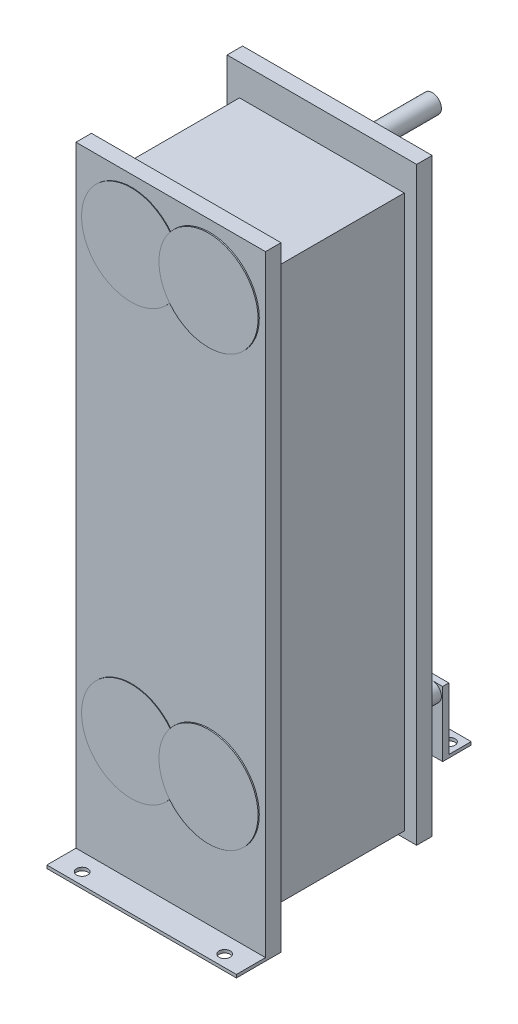
ISO-10303-21;
HEADER;
FILE_DESCRIPTION(('STEP AP214'),'2;1');
FILE_NAME('part.step','',(''),(''),'','','');
FILE_SCHEMA(('AUTOMOTIVE_DESIGN { 1 0 10303 214 1 1 1 1 }'));
ENDSEC;
DATA;
#1=APPLICATION_CONTEXT('core data for automotive mechanical design processes');
#2=APPLICATION_PROTOCOL_DEFINITION('international standard','automotive_design',2000,#1);
#3=PRODUCT_CONTEXT('',#1,'mechanical');
#4=PRODUCT('Part','Part','',(#3));
#5=PRODUCT_RELATED_PRODUCT_CATEGORY('part','',(#4));
#6=PRODUCT_DEFINITION_FORMATION('','',#4);
#7=PRODUCT_DEFINITION_CONTEXT('part definition',#1,'design');
#8=PRODUCT_DEFINITION('design','',#6,#7);
#9=PRODUCT_DEFINITION_SHAPE('','',#8);
#10=(LENGTH_UNIT() NAMED_UNIT(*) SI_UNIT(.MILLI.,.METRE.));
#11=(NAMED_UNIT(*) PLANE_ANGLE_UNIT() SI_UNIT($,.RADIAN.));
#12=(NAMED_UNIT(*) SI_UNIT($,.STERADIAN.) SOLID_ANGLE_UNIT());
#13=UNCERTAINTY_MEASURE_WITH_UNIT(LENGTH_MEASURE(1.E-05),#10,'distance_accuracy_value','');
#14=(GEOMETRIC_REPRESENTATION_CONTEXT(3) GLOBAL_UNCERTAINTY_ASSIGNED_CONTEXT((#13)) GLOBAL_UNIT_ASSIGNED_CONTEXT((#10,
#11,#12)) REPRESENTATION_CONTEXT('',''));
#15=CARTESIAN_POINT('',(0.,0.,0.));
#16=DIRECTION('',(0.,0.,1.));
#17=DIRECTION('',(1.,0.,0.));
#18=AXIS2_PLACEMENT_3D('',#15,#16,#17);
#19=CARTESIAN_POINT('',(153.,-496.,25.));
#20=DIRECTION('',(0.,0.,1.));
#21=DIRECTION('',(1.,0.,0.));
#22=AXIS2_PLACEMENT_3D('',#19,#20,#21);
#23=PLANE('',#22);
#24=CARTESIAN_POINT('',(63.0000000000001,-296.,25.));
#25=DIRECTION('',(0.,0.,1.));
#26=DIRECTION('',(1.,0.,0.));
#27=AXIS2_PLACEMENT_3D('',#24,#25,#26);
#28=CIRCLE('',#27,80.);
#29=CARTESIAN_POINT('',(0.,-345.305172142484,25.));
#30=VERTEX_POINT('',#29);
#31=CARTESIAN_POINT('',(0.,-246.694827857516,25.));
#32=VERTEX_POINT('',#31);
#33=EDGE_CURVE('E48',#30,#32,#28,.T.);
#34=ORIENTED_EDGE('',*,*,#33,.F.);
#35=CARTESIAN_POINT('',(-63.0000000000001,-296.,25.));
#36=DIRECTION('',(0.,0.,1.));
#37=DIRECTION('',(1.,0.,0.));
#38=AXIS2_PLACEMENT_3D('',#35,#36,#37);
#39=CIRCLE('',#38,80.);
#40=EDGE_CURVE('E206',#32,#30,#39,.T.);
#41=ORIENTED_EDGE('',*,*,#40,.F.);
#42=EDGE_LOOP('',(#34,#41));
#43=FACE_BOUND('',#42,.T.);
#44=CARTESIAN_POINT('',(63.,398.,25.));
#45=DIRECTION('',(0.,0.,1.));
#46=DIRECTION('',(1.,0.,0.));
#47=AXIS2_PLACEMENT_3D('',#44,#45,#46);
#48=CIRCLE('',#47,80.);
#49=CARTESIAN_POINT('',(0.,348.694827857516,25.));
#50=VERTEX_POINT('',#49);
#51=CARTESIAN_POINT('',(0.,447.305172142484,25.));
#52=VERTEX_POINT('',#51);
#53=EDGE_CURVE('E201',#50,#52,#48,.T.);
#54=ORIENTED_EDGE('',*,*,#53,.F.);
#55=CARTESIAN_POINT('',(-63.,398.,25.));
#56=DIRECTION('',(0.,0.,1.));
#57=DIRECTION('',(1.,0.,0.));
#58=AXIS2_PLACEMENT_3D('',#55,#56,#57);
#59=CIRCLE('',#58,80.);
#60=EDGE_CURVE('E333',#52,#50,#59,.T.);
#61=ORIENTED_EDGE('',*,*,#60,.F.);
#62=EDGE_LOOP('',(#54,#61));
#63=FACE_BOUND('',#62,.T.);
#64=DIRECTION('',(0.,-1.,0.));
#65=VECTOR('',#64,1.);
#66=CARTESIAN_POINT('',(-153.,496.,25.));
#67=LINE('',#66,#65);
#68=CARTESIAN_POINT('',(-153.,496.,25.));
#69=VERTEX_POINT('',#68);
#70=CARTESIAN_POINT('',(-153.,-491.,25.));
#71=VERTEX_POINT('',#70);
#72=EDGE_CURVE('E322',#69,#71,#67,.T.);
#73=ORIENTED_EDGE('',*,*,#72,.T.);
#74=DIRECTION('',(1.,0.,0.));
#75=VECTOR('',#74,1.);
#76=CARTESIAN_POINT('',(-153.,-491.,25.));
#77=LINE('',#76,#75);
#78=CARTESIAN_POINT('',(153.,-491.,25.));
#79=VERTEX_POINT('',#78);
#80=EDGE_CURVE('E316',#71,#79,#77,.T.);
#81=ORIENTED_EDGE('',*,*,#80,.T.);
#82=DIRECTION('',(0.,1.,0.));
#83=VECTOR('',#82,1.);
#84=CARTESIAN_POINT('',(153.,496.,25.));
#85=LINE('',#84,#83);
#86=CARTESIAN_POINT('',(153.,496.,25.));
#87=VERTEX_POINT('',#86);
#88=EDGE_CURVE('E365',#79,#87,#85,.T.);
#89=ORIENTED_EDGE('',*,*,#88,.T.);
#90=DIRECTION('',(-1.,0.,0.));
#91=VECTOR('',#90,1.);
#92=CARTESIAN_POINT('',(-153.,496.,25.));
#93=LINE('',#92,#91);
#94=EDGE_CURVE('E357',#87,#69,#93,.T.);
#95=ORIENTED_EDGE('',*,*,#94,.T.);
#96=EDGE_LOOP('',(#73,#81,#89,#95));
#97=FACE_BOUND('',#96,.T.);
#98=ADVANCED_FACE('F34',(#43,#63,#97),#23,.T.);
#99=CARTESIAN_POINT('',(153.,-456.,-244.));
#100=DIRECTION('',(0.,0.,-1.));
#101=DIRECTION('',(-1.,0.,0.));
#102=AXIS2_PLACEMENT_3D('',#99,#100,#101);
#103=PLANE('',#102);
#104=CARTESIAN_POINT('',(-1.11150550783782E-13,-406.,-244.));
#105=DIRECTION('',(0.,0.,-1.));
#106=DIRECTION('',(-1.,0.,0.));
#107=AXIS2_PLACEMENT_3D('',#104,#105,#106);
#108=CIRCLE('',#107,15.);
#109=CARTESIAN_POINT('',(-15.0000000000001,-406.,-244.));
#110=VERTEX_POINT('',#109);
#111=EDGE_CURVE('E291',#110,#110,#108,.T.);
#112=ORIENTED_EDGE('',*,*,#111,.F.);
#113=EDGE_LOOP('',(#112));
#114=FACE_BOUND('',#113,.T.);
#115=DIRECTION('',(0.,-1.,0.));
#116=VECTOR('',#115,1.);
#117=CARTESIAN_POINT('',(153.,496.,-244.));
#118=LINE('',#117,#116);
#119=CARTESIAN_POINT('',(153.,496.,-244.));
#120=VERTEX_POINT('',#119);
#121=CARTESIAN_POINT('',(153.,-456.,-244.));
#122=VERTEX_POINT('',#121);
#123=EDGE_CURVE('E412',#120,#122,#118,.T.);
#124=ORIENTED_EDGE('',*,*,#123,.T.);
#125=DIRECTION('',(-1.,0.,0.));
#126=VECTOR('',#125,1.);
#127=CARTESIAN_POINT('',(153.,-456.,-244.));
#128=LINE('',#127,#126);
#129=CARTESIAN_POINT('',(-153.,-456.,-244.));
#130=VERTEX_POINT('',#129);
#131=EDGE_CURVE('E415',#122,#130,#128,.T.);
#132=ORIENTED_EDGE('',*,*,#131,.T.);
#133=DIRECTION('',(0.,1.,0.));
#134=VECTOR('',#133,1.);
#135=CARTESIAN_POINT('',(-153.,496.,-244.));
#136=LINE('',#135,#134);
#137=CARTESIAN_POINT('',(-153.,496.,-244.));
#138=VERTEX_POINT('',#137);
#139=EDGE_CURVE('E418',#130,#138,#136,.T.);
#140=ORIENTED_EDGE('',*,*,#139,.T.);
#141=DIRECTION('',(1.,0.,0.));
#142=VECTOR('',#141,1.);
#143=CARTESIAN_POINT('',(153.,496.,-244.));
#144=LINE('',#143,#142);
#145=EDGE_CURVE('E420',#138,#120,#144,.T.);
#146=ORIENTED_EDGE('',*,*,#145,.T.);
#147=EDGE_LOOP('',(#124,#132,#140,#146));
#148=FACE_BOUND('',#147,.T.);
#149=CARTESIAN_POINT('',(0.,416.,-244.));
#150=DIRECTION('',(0.,0.,-1.));
#151=DIRECTION('',(-1.,0.,0.));
#152=AXIS2_PLACEMENT_3D('',#149,#150,#151);
#153=CIRCLE('',#152,15.);
#154=CARTESIAN_POINT('',(-15.,416.,-244.));
#155=VERTEX_POINT('',#154);
#156=EDGE_CURVE('E228',#155,#155,#153,.T.);
#157=ORIENTED_EDGE('',*,*,#156,.F.);
#158=EDGE_LOOP('',(#157));
#159=FACE_BOUND('',#158,.T.);
#160=ADVANCED_FACE('F351',(#114,#148,#159),#103,.T.);
#161=CARTESIAN_POINT('',(153.,-496.,0.));
#162=DIRECTION('',(0.,0.,1.));
#163=DIRECTION('',(1.,0.,0.));
#164=AXIS2_PLACEMENT_3D('',#161,#162,#163);
#165=PLANE('',#164);
#166=DIRECTION('',(0.,1.,0.));
#167=VECTOR('',#166,1.);
#168=CARTESIAN_POINT('',(153.,496.,0.));
#169=LINE('',#168,#167);
#170=CARTESIAN_POINT('',(153.,-496.,0.));
#171=VERTEX_POINT('',#170);
#172=CARTESIAN_POINT('',(153.,496.,0.));
#173=VERTEX_POINT('',#172);
#174=EDGE_CURVE('E373',#171,#173,#169,.T.);
#175=ORIENTED_EDGE('',*,*,#174,.F.);
#176=DIRECTION('',(1.,0.,0.));
#177=VECTOR('',#176,1.);
#178=CARTESIAN_POINT('',(-153.,-496.,0.));
#179=LINE('',#178,#177);
#180=CARTESIAN_POINT('',(-153.,-496.,0.));
#181=VERTEX_POINT('',#180);
#182=EDGE_CURVE('E367',#181,#171,#179,.T.);
#183=ORIENTED_EDGE('',*,*,#182,.F.);
#184=DIRECTION('',(0.,-1.,0.));
#185=VECTOR('',#184,1.);
#186=CARTESIAN_POINT('',(-153.,496.,0.));
#187=LINE('',#186,#185);
#188=CARTESIAN_POINT('',(-153.,496.,0.));
#189=VERTEX_POINT('',#188);
#190=EDGE_CURVE('E379',#189,#181,#187,.T.);
#191=ORIENTED_EDGE('',*,*,#190,.F.);
#192=DIRECTION('',(-1.,0.,0.));
#193=VECTOR('',#192,1.);
#194=CARTESIAN_POINT('',(-153.,496.,0.));
#195=LINE('',#194,#193);
#196=EDGE_CURVE('E376',#173,#189,#195,.T.);
#197=ORIENTED_EDGE('',*,*,#196,.F.);
#198=EDGE_LOOP('',(#175,#183,#191,#197));
#199=FACE_BOUND('',#198,.T.);
#200=DIRECTION('',(0.,-1.,0.));
#201=VECTOR('',#200,1.);
#202=CARTESIAN_POINT('',(133.,446.,0.));
#203=LINE('',#202,#201);
#204=CARTESIAN_POINT('',(133.,446.,0.));
#205=VERTEX_POINT('',#204);
#206=CARTESIAN_POINT('',(133.,-446.,0.));
#207=VERTEX_POINT('',#206);
#208=EDGE_CURVE('E455',#205,#207,#203,.T.);
#209=ORIENTED_EDGE('',*,*,#208,.F.);
#210=DIRECTION('',(1.,0.,0.));
#211=VECTOR('',#210,1.);
#212=CARTESIAN_POINT('',(-133.,446.,0.));
#213=LINE('',#212,#211);
#214=CARTESIAN_POINT('',(-133.,446.,0.));
#215=VERTEX_POINT('',#214);
#216=EDGE_CURVE('E442',#215,#205,#213,.T.);
#217=ORIENTED_EDGE('',*,*,#216,.F.);
#218=DIRECTION('',(0.,1.,0.));
#219=VECTOR('',#218,1.);
#220=CARTESIAN_POINT('',(-133.,446.,0.));
#221=LINE('',#220,#219);
#222=CARTESIAN_POINT('',(-133.,-446.,0.));
#223=VERTEX_POINT('',#222);
#224=EDGE_CURVE('E447',#223,#215,#221,.T.);
#225=ORIENTED_EDGE('',*,*,#224,.F.);
#226=DIRECTION('',(-1.,0.,0.));
#227=VECTOR('',#226,1.);
#228=CARTESIAN_POINT('',(-133.,-446.,0.));
#229=LINE('',#228,#227);
#230=EDGE_CURVE('E451',#207,#223,#229,.T.);
#231=ORIENTED_EDGE('',*,*,#230,.F.);
#232=EDGE_LOOP('',(#209,#217,#225,#231));
#233=FACE_BOUND('',#232,.T.);
#234=ADVANCED_FACE('F395',(#199,#233),#165,.F.);
#235=CARTESIAN_POINT('',(153.,496.,25.));
#236=DIRECTION('',(-1.,0.,0.));
#237=DIRECTION('',(0.,-1.,0.));
#238=AXIS2_PLACEMENT_3D('',#235,#236,#237);
#239=PLANE('',#238);
#240=ORIENTED_EDGE('',*,*,#174,.T.);
#241=DIRECTION('',(0.,0.,-1.));
#242=VECTOR('',#241,1.);
#243=CARTESIAN_POINT('',(153.,496.,25.));
#244=LINE('',#243,#242);
#245=EDGE_CURVE('E336',#87,#173,#244,.T.);
#246=ORIENTED_EDGE('',*,*,#245,.F.);
#247=ORIENTED_EDGE('',*,*,#88,.F.);
#248=DIRECTION('',(0.,0.,1.));
#249=VECTOR('',#248,1.);
#250=CARTESIAN_POINT('',(153.,-491.,25.));
#251=LINE('',#250,#249);
#252=CARTESIAN_POINT('',(153.,-491.,72.));
#253=VERTEX_POINT('',#252);
#254=EDGE_CURVE('E320',#79,#253,#251,.T.);
#255=ORIENTED_EDGE('',*,*,#254,.T.);
#256=DIRECTION('',(0.,-1.,0.));
#257=VECTOR('',#256,1.);
#258=CARTESIAN_POINT('',(153.,-491.,72.));
#259=LINE('',#258,#257);
#260=CARTESIAN_POINT('',(153.,-496.,72.));
#261=VERTEX_POINT('',#260);
#262=EDGE_CURVE('E410',#253,#261,#259,.T.);
#263=ORIENTED_EDGE('',*,*,#262,.T.);
#264=DIRECTION('',(0.,0.,-1.));
#265=VECTOR('',#264,1.);
#266=CARTESIAN_POINT('',(153.,-496.,25.));
#267=LINE('',#266,#265);
#268=EDGE_CURVE('E361',#261,#171,#267,.T.);
#269=ORIENTED_EDGE('',*,*,#268,.T.);
#270=EDGE_LOOP('',(#240,#246,#247,#255,#263,#269));
#271=FACE_BOUND('',#270,.T.);
#272=ADVANCED_FACE('F36',(#271),#239,.F.);
#273=CARTESIAN_POINT('',(-153.,496.,25.));
#274=DIRECTION('',(0.,-1.,0.));
#275=DIRECTION('',(0.,0.,-1.));
#276=AXIS2_PLACEMENT_3D('',#273,#274,#275);
#277=PLANE('',#276);
#278=ORIENTED_EDGE('',*,*,#196,.T.);
#279=DIRECTION('',(0.,0.,-1.));
#280=VECTOR('',#279,1.);
#281=CARTESIAN_POINT('',(-153.,496.,25.));
#282=LINE('',#281,#280);
#283=EDGE_CURVE('E384',#69,#189,#282,.T.);
#284=ORIENTED_EDGE('',*,*,#283,.F.);
#285=ORIENTED_EDGE('',*,*,#94,.F.);
#286=ORIENTED_EDGE('',*,*,#245,.T.);
#287=EDGE_LOOP('',(#278,#284,#285,#286));
#288=FACE_BOUND('',#287,.T.);
#289=ADVANCED_FACE('F389',(#288),#277,.F.);
#290=CARTESIAN_POINT('',(-153.,496.,25.));
#291=DIRECTION('',(1.,0.,0.));
#292=DIRECTION('',(0.,1.,0.));
#293=AXIS2_PLACEMENT_3D('',#290,#291,#292);
#294=PLANE('',#293);
#295=ORIENTED_EDGE('',*,*,#190,.T.);
#296=DIRECTION('',(0.,0.,-1.));
#297=VECTOR('',#296,1.);
#298=CARTESIAN_POINT('',(-153.,-496.,25.));
#299=LINE('',#298,#297);
#300=CARTESIAN_POINT('',(-153.,-496.,72.));
#301=VERTEX_POINT('',#300);
#302=EDGE_CURVE('E363',#301,#181,#299,.T.);
#303=ORIENTED_EDGE('',*,*,#302,.F.);
#304=DIRECTION('',(0.,-1.,0.));
#305=VECTOR('',#304,1.);
#306=CARTESIAN_POINT('',(-153.,-491.,72.));
#307=LINE('',#306,#305);
#308=CARTESIAN_POINT('',(-153.,-491.,72.));
#309=VERTEX_POINT('',#308);
#310=EDGE_CURVE('E407',#309,#301,#307,.T.);
#311=ORIENTED_EDGE('',*,*,#310,.F.);
#312=DIRECTION('',(0.,0.,-1.));
#313=VECTOR('',#312,1.);
#314=CARTESIAN_POINT('',(-153.,-491.,25.));
#315=LINE('',#314,#313);
#316=EDGE_CURVE('E321',#309,#71,#315,.T.);
#317=ORIENTED_EDGE('',*,*,#316,.T.);
#318=ORIENTED_EDGE('',*,*,#72,.F.);
#319=ORIENTED_EDGE('',*,*,#283,.T.);
#320=EDGE_LOOP('',(#295,#303,#311,#317,#318,#319));
#321=FACE_BOUND('',#320,.T.);
#322=ADVANCED_FACE('F398',(#321),#294,.F.);
#323=CARTESIAN_POINT('',(-153.,-496.,25.));
#324=DIRECTION('',(0.,1.,0.));
#325=DIRECTION('',(0.,0.,1.));
#326=AXIS2_PLACEMENT_3D('',#323,#324,#325);
#327=PLANE('',#326);
#328=ORIENTED_EDGE('',*,*,#182,.T.);
#329=ORIENTED_EDGE('',*,*,#268,.F.);
#330=DIRECTION('',(-1.,0.,0.));
#331=VECTOR('',#330,1.);
#332=CARTESIAN_POINT('',(-153.,-496.,72.));
#333=LINE('',#332,#331);
#334=EDGE_CURVE('E308',#261,#301,#333,.T.);
#335=ORIENTED_EDGE('',*,*,#334,.T.);
#336=ORIENTED_EDGE('',*,*,#302,.T.);
#337=EDGE_LOOP('',(#328,#329,#335,#336));
#338=FACE_BOUND('',#337,.T.);
#339=CARTESIAN_POINT('',(115.,-496.,53.));
#340=DIRECTION('',(0.,-1.,0.));
#341=DIRECTION('',(0.,0.,-1.));
#342=AXIS2_PLACEMENT_3D('',#339,#340,#341);
#343=CIRCLE('',#342,9.00000000000001);
#344=CARTESIAN_POINT('',(115.,-496.,44.));
#345=VERTEX_POINT('',#344);
#346=EDGE_CURVE('E298',#345,#345,#343,.T.);
#347=ORIENTED_EDGE('',*,*,#346,.F.);
#348=EDGE_LOOP('',(#347));
#349=FACE_BOUND('',#348,.T.);
#350=CARTESIAN_POINT('',(-115.,-496.,53.));
#351=DIRECTION('',(0.,-1.,0.));
#352=DIRECTION('',(0.,0.,-1.));
#353=AXIS2_PLACEMENT_3D('',#350,#351,#352);
#354=CIRCLE('',#353,9.00000000000001);
#355=CARTESIAN_POINT('',(-115.,-496.,44.));
#356=VERTEX_POINT('',#355);
#357=EDGE_CURVE('E302',#356,#356,#354,.T.);
#358=ORIENTED_EDGE('',*,*,#357,.F.);
#359=EDGE_LOOP('',(#358));
#360=FACE_BOUND('',#359,.T.);
#361=ADVANCED_FACE('F402',(#338,#349,#360),#327,.F.);
#362=CARTESIAN_POINT('',(133.,446.,-1149.81684557167));
#363=DIRECTION('',(-1.,0.,0.));
#364=DIRECTION('',(0.,0.,1.));
#365=AXIS2_PLACEMENT_3D('',#362,#363,#364);
#366=PLANE('',#365);
#367=DIRECTION('',(0.,-1.,0.));
#368=VECTOR('',#367,1.);
#369=CARTESIAN_POINT('',(133.,446.,-219.));
#370=LINE('',#369,#368);
#371=CARTESIAN_POINT('',(133.,446.,-219.));
#372=VERTEX_POINT('',#371);
#373=CARTESIAN_POINT('',(133.,-446.,-219.));
#374=VERTEX_POINT('',#373);
#375=EDGE_CURVE('E463',#372,#374,#370,.T.);
#376=ORIENTED_EDGE('',*,*,#375,.F.);
#377=DIRECTION('',(0.,0.,1.));
#378=VECTOR('',#377,1.);
#379=CARTESIAN_POINT('',(133.,446.,-1149.81684557167));
#380=LINE('',#379,#378);
#381=EDGE_CURVE('E441',#372,#205,#380,.T.);
#382=ORIENTED_EDGE('',*,*,#381,.T.);
#383=ORIENTED_EDGE('',*,*,#208,.T.);
#384=DIRECTION('',(0.,0.,1.));
#385=VECTOR('',#384,1.);
#386=CARTESIAN_POINT('',(133.,-446.,-1149.81684557167));
#387=LINE('',#386,#385);
#388=EDGE_CURVE('E454',#374,#207,#387,.T.);
#389=ORIENTED_EDGE('',*,*,#388,.F.);
#390=EDGE_LOOP('',(#376,#382,#383,#389));
#391=FACE_BOUND('',#390,.T.);
#392=ADVANCED_FACE('F476',(#391),#366,.F.);
#393=CARTESIAN_POINT('',(-133.,-446.,-1149.81684557167));
#394=DIRECTION('',(0.,1.,0.));
#395=DIRECTION('',(0.,0.,1.));
#396=AXIS2_PLACEMENT_3D('',#393,#394,#395);
#397=PLANE('',#396);
#398=DIRECTION('',(-1.,0.,0.));
#399=VECTOR('',#398,1.);
#400=CARTESIAN_POINT('',(-133.,-446.,-219.));
#401=LINE('',#400,#399);
#402=CARTESIAN_POINT('',(-133.,-446.,-219.));
#403=VERTEX_POINT('',#402);
#404=EDGE_CURVE('E460',#374,#403,#401,.T.);
#405=ORIENTED_EDGE('',*,*,#404,.F.);
#406=ORIENTED_EDGE('',*,*,#388,.T.);
#407=ORIENTED_EDGE('',*,*,#230,.T.);
#408=DIRECTION('',(0.,0.,1.));
#409=VECTOR('',#408,1.);
#410=CARTESIAN_POINT('',(-133.,-446.,-1149.81684557167));
#411=LINE('',#410,#409);
#412=EDGE_CURVE('E450',#403,#223,#411,.T.);
#413=ORIENTED_EDGE('',*,*,#412,.F.);
#414=EDGE_LOOP('',(#405,#406,#407,#413));
#415=FACE_BOUND('',#414,.T.);
#416=ADVANCED_FACE('F483',(#415),#397,.F.);
#417=CARTESIAN_POINT('',(-133.,446.,-1149.81684557167));
#418=DIRECTION('',(1.,0.,0.));
#419=DIRECTION('',(0.,0.,-1.));
#420=AXIS2_PLACEMENT_3D('',#417,#418,#419);
#421=PLANE('',#420);
#422=DIRECTION('',(0.,1.,0.));
#423=VECTOR('',#422,1.);
#424=CARTESIAN_POINT('',(-133.,446.,-219.));
#425=LINE('',#424,#423);
#426=CARTESIAN_POINT('',(-133.,446.,-219.));
#427=VERTEX_POINT('',#426);
#428=EDGE_CURVE('E377',#403,#427,#425,.T.);
#429=ORIENTED_EDGE('',*,*,#428,.F.);
#430=ORIENTED_EDGE('',*,*,#412,.T.);
#431=ORIENTED_EDGE('',*,*,#224,.T.);
#432=DIRECTION('',(0.,0.,1.));
#433=VECTOR('',#432,1.);
#434=CARTESIAN_POINT('',(-133.,446.,-1149.81684557167));
#435=LINE('',#434,#433);
#436=EDGE_CURVE('E446',#427,#215,#435,.T.);
#437=ORIENTED_EDGE('',*,*,#436,.F.);
#438=EDGE_LOOP('',(#429,#430,#431,#437));
#439=FACE_BOUND('',#438,.T.);
#440=ADVANCED_FACE('F487',(#439),#421,.F.);
#441=CARTESIAN_POINT('',(-133.,446.,-1149.81684557167));
#442=DIRECTION('',(0.,-1.,0.));
#443=DIRECTION('',(0.,0.,-1.));
#444=AXIS2_PLACEMENT_3D('',#441,#442,#443);
#445=PLANE('',#444);
#446=DIRECTION('',(1.,0.,0.));
#447=VECTOR('',#446,1.);
#448=CARTESIAN_POINT('',(-133.,446.,-219.));
#449=LINE('',#448,#447);
#450=EDGE_CURVE('E445',#427,#372,#449,.T.);
#451=ORIENTED_EDGE('',*,*,#450,.F.);
#452=ORIENTED_EDGE('',*,*,#436,.T.);
#453=ORIENTED_EDGE('',*,*,#216,.T.);
#454=ORIENTED_EDGE('',*,*,#381,.F.);
#455=EDGE_LOOP('',(#451,#452,#453,#454));
#456=FACE_BOUND('',#455,.T.);
#457=ADVANCED_FACE('F480',(#456),#445,.F.);
#458=CARTESIAN_POINT('',(153.,-456.,-219.));
#459=DIRECTION('',(0.,0.,-1.));
#460=DIRECTION('',(-1.,0.,0.));
#461=AXIS2_PLACEMENT_3D('',#458,#459,#460);
#462=PLANE('',#461);
#463=DIRECTION('',(0.,-1.,0.));
#464=VECTOR('',#463,1.);
#465=CARTESIAN_POINT('',(153.,496.,-219.));
#466=LINE('',#465,#464);
#467=CARTESIAN_POINT('',(153.,496.,-219.));
#468=VERTEX_POINT('',#467);
#469=CARTESIAN_POINT('',(153.,-456.,-219.));
#470=VERTEX_POINT('',#469);
#471=EDGE_CURVE('E409',#468,#470,#466,.T.);
#472=ORIENTED_EDGE('',*,*,#471,.F.);
#473=DIRECTION('',(1.,0.,0.));
#474=VECTOR('',#473,1.);
#475=CARTESIAN_POINT('',(153.,496.,-219.));
#476=LINE('',#475,#474);
#477=CARTESIAN_POINT('',(-153.,496.,-219.));
#478=VERTEX_POINT('',#477);
#479=EDGE_CURVE('E416',#478,#468,#476,.T.);
#480=ORIENTED_EDGE('',*,*,#479,.F.);
#481=DIRECTION('',(0.,1.,0.));
#482=VECTOR('',#481,1.);
#483=CARTESIAN_POINT('',(-153.,496.,-219.));
#484=LINE('',#483,#482);
#485=CARTESIAN_POINT('',(-153.,-456.,-219.));
#486=VERTEX_POINT('',#485);
#487=EDGE_CURVE('E427',#486,#478,#484,.T.);
#488=ORIENTED_EDGE('',*,*,#487,.F.);
#489=DIRECTION('',(-1.,0.,0.));
#490=VECTOR('',#489,1.);
#491=CARTESIAN_POINT('',(153.,-456.,-219.));
#492=LINE('',#491,#490);
#493=EDGE_CURVE('E425',#470,#486,#492,.T.);
#494=ORIENTED_EDGE('',*,*,#493,.F.);
#495=EDGE_LOOP('',(#472,#480,#488,#494));
#496=FACE_BOUND('',#495,.T.);
#497=ORIENTED_EDGE('',*,*,#450,.T.);
#498=ORIENTED_EDGE('',*,*,#375,.T.);
#499=ORIENTED_EDGE('',*,*,#404,.T.);
#500=ORIENTED_EDGE('',*,*,#428,.T.);
#501=EDGE_LOOP('',(#497,#498,#499,#500));
#502=FACE_BOUND('',#501,.T.);
#503=ADVANCED_FACE('F485',(#496,#502),#462,.F.);
#504=CARTESIAN_POINT('',(153.,496.,-244.));
#505=DIRECTION('',(-1.,0.,0.));
#506=DIRECTION('',(0.,-1.,0.));
#507=AXIS2_PLACEMENT_3D('',#504,#505,#506);
#508=PLANE('',#507);
#509=ORIENTED_EDGE('',*,*,#471,.T.);
#510=DIRECTION('',(0.,0.,1.));
#511=VECTOR('',#510,1.);
#512=CARTESIAN_POINT('',(153.,-456.,-244.));
#513=LINE('',#512,#511);
#514=EDGE_CURVE('E438',#122,#470,#513,.T.);
#515=ORIENTED_EDGE('',*,*,#514,.F.);
#516=ORIENTED_EDGE('',*,*,#123,.F.);
#517=DIRECTION('',(0.,0.,1.));
#518=VECTOR('',#517,1.);
#519=CARTESIAN_POINT('',(153.,496.,-244.));
#520=LINE('',#519,#518);
#521=EDGE_CURVE('E422',#120,#468,#520,.T.);
#522=ORIENTED_EDGE('',*,*,#521,.T.);
#523=EDGE_LOOP('',(#509,#515,#516,#522));
#524=FACE_BOUND('',#523,.T.);
#525=ADVANCED_FACE('F683',(#524),#508,.F.);
#526=CARTESIAN_POINT('',(153.,-456.,-244.));
#527=DIRECTION('',(0.,1.,0.));
#528=DIRECTION('',(-1.,0.,0.));
#529=AXIS2_PLACEMENT_3D('',#526,#527,#528);
#530=PLANE('',#529);
#531=ORIENTED_EDGE('',*,*,#493,.T.);
#532=DIRECTION('',(0.,0.,1.));
#533=VECTOR('',#532,1.);
#534=CARTESIAN_POINT('',(-153.,-456.,-244.));
#535=LINE('',#534,#533);
#536=EDGE_CURVE('E435',#130,#486,#535,.T.);
#537=ORIENTED_EDGE('',*,*,#536,.F.);
#538=ORIENTED_EDGE('',*,*,#131,.F.);
#539=ORIENTED_EDGE('',*,*,#514,.T.);
#540=EDGE_LOOP('',(#531,#537,#538,#539));
#541=FACE_BOUND('',#540,.T.);
#542=ADVANCED_FACE('F691',(#541),#530,.F.);
#543=CARTESIAN_POINT('',(-153.,496.,-244.));
#544=DIRECTION('',(1.,0.,0.));
#545=DIRECTION('',(0.,0.,-1.));
#546=AXIS2_PLACEMENT_3D('',#543,#544,#545);
#547=PLANE('',#546);
#548=ORIENTED_EDGE('',*,*,#487,.T.);
#549=DIRECTION('',(0.,0.,1.));
#550=VECTOR('',#549,1.);
#551=CARTESIAN_POINT('',(-153.,496.,-244.));
#552=LINE('',#551,#550);
#553=EDGE_CURVE('E432',#138,#478,#552,.T.);
#554=ORIENTED_EDGE('',*,*,#553,.F.);
#555=ORIENTED_EDGE('',*,*,#139,.F.);
#556=ORIENTED_EDGE('',*,*,#536,.T.);
#557=EDGE_LOOP('',(#548,#554,#555,#556));
#558=FACE_BOUND('',#557,.T.);
#559=ADVANCED_FACE('F687',(#558),#547,.F.);
#560=CARTESIAN_POINT('',(153.,496.,-244.));
#561=DIRECTION('',(0.,-1.,0.));
#562=DIRECTION('',(0.,0.,-1.));
#563=AXIS2_PLACEMENT_3D('',#560,#561,#562);
#564=PLANE('',#563);
#565=ORIENTED_EDGE('',*,*,#479,.T.);
#566=ORIENTED_EDGE('',*,*,#521,.F.);
#567=ORIENTED_EDGE('',*,*,#145,.F.);
#568=ORIENTED_EDGE('',*,*,#553,.T.);
#569=EDGE_LOOP('',(#565,#566,#567,#568));
#570=FACE_BOUND('',#569,.T.);
#571=ADVANCED_FACE('F679',(#570),#564,.F.);
#572=CARTESIAN_POINT('',(-153.,-491.,72.));
#573=DIRECTION('',(0.,0.,1.));
#574=DIRECTION('',(1.,0.,0.));
#575=AXIS2_PLACEMENT_3D('',#572,#573,#574);
#576=PLANE('',#575);
#577=ORIENTED_EDGE('',*,*,#334,.F.);
#578=ORIENTED_EDGE('',*,*,#262,.F.);
#579=DIRECTION('',(-1.,0.,0.));
#580=VECTOR('',#579,1.);
#581=CARTESIAN_POINT('',(-153.,-491.,72.));
#582=LINE('',#581,#580);
#583=EDGE_CURVE('E313',#253,#309,#582,.T.);
#584=ORIENTED_EDGE('',*,*,#583,.T.);
#585=ORIENTED_EDGE('',*,*,#310,.T.);
#586=EDGE_LOOP('',(#577,#578,#584,#585));
#587=FACE_BOUND('',#586,.T.);
#588=ADVANCED_FACE('F676',(#587),#576,.T.);
#589=CARTESIAN_POINT('',(-153.,-491.,72.));
#590=DIRECTION('',(0.,1.,0.));
#591=DIRECTION('',(0.,0.,1.));
#592=AXIS2_PLACEMENT_3D('',#589,#590,#591);
#593=PLANE('',#592);
#594=CARTESIAN_POINT('',(115.,-491.,53.));
#595=DIRECTION('',(0.,-1.,0.));
#596=DIRECTION('',(0.,0.,-1.));
#597=AXIS2_PLACEMENT_3D('',#594,#595,#596);
#598=CIRCLE('',#597,9.00000000000001);
#599=CARTESIAN_POINT('',(115.,-491.,44.));
#600=VERTEX_POINT('',#599);
#601=EDGE_CURVE('E299',#600,#600,#598,.T.);
#602=ORIENTED_EDGE('',*,*,#601,.T.);
#603=EDGE_LOOP('',(#602));
#604=FACE_BOUND('',#603,.T.);
#605=CARTESIAN_POINT('',(-115.,-491.,53.));
#606=DIRECTION('',(0.,-1.,0.));
#607=DIRECTION('',(0.,0.,-1.));
#608=AXIS2_PLACEMENT_3D('',#605,#606,#607);
#609=CIRCLE('',#608,9.00000000000001);
#610=CARTESIAN_POINT('',(-115.,-491.,44.));
#611=VERTEX_POINT('',#610);
#612=EDGE_CURVE('E305',#611,#611,#609,.T.);
#613=ORIENTED_EDGE('',*,*,#612,.T.);
#614=EDGE_LOOP('',(#613));
#615=FACE_BOUND('',#614,.T.);
#616=ORIENTED_EDGE('',*,*,#316,.F.);
#617=ORIENTED_EDGE('',*,*,#583,.F.);
#618=ORIENTED_EDGE('',*,*,#254,.F.);
#619=ORIENTED_EDGE('',*,*,#80,.F.);
#620=EDGE_LOOP('',(#616,#617,#618,#619));
#621=FACE_BOUND('',#620,.T.);
#622=ADVANCED_FACE('F672',(#604,#615,#621),#593,.T.);
#623=CARTESIAN_POINT('',(-115.,-491.,53.));
#624=DIRECTION('',(0.,-1.,0.));
#625=DIRECTION('',(0.,0.,-1.));
#626=AXIS2_PLACEMENT_3D('',#623,#624,#625);
#627=CYLINDRICAL_SURFACE('',#626,9.00000000000001);
#628=ORIENTED_EDGE('',*,*,#612,.F.);
#629=EDGE_LOOP('',(#628));
#630=FACE_BOUND('',#629,.T.);
#631=ORIENTED_EDGE('',*,*,#357,.T.);
#632=EDGE_LOOP('',(#631));
#633=FACE_BOUND('',#632,.T.);
#634=ADVANCED_FACE('F668',(#630,#633),#627,.F.);
#635=CARTESIAN_POINT('',(115.,-491.,53.));
#636=DIRECTION('',(0.,-1.,0.));
#637=DIRECTION('',(0.,0.,-1.));
#638=AXIS2_PLACEMENT_3D('',#635,#636,#637);
#639=CYLINDRICAL_SURFACE('',#638,9.00000000000001);
#640=ORIENTED_EDGE('',*,*,#601,.F.);
#641=EDGE_LOOP('',(#640));
#642=FACE_BOUND('',#641,.T.);
#643=ORIENTED_EDGE('',*,*,#346,.T.);
#644=EDGE_LOOP('',(#643));
#645=FACE_BOUND('',#644,.T.);
#646=ADVANCED_FACE('F664',(#642,#645),#639,.F.);
#647=CARTESIAN_POINT('',(-1.11150550783782E-13,-406.,-439.426406871193));
#648=DIRECTION('',(0.,0.,1.));
#649=DIRECTION('',(1.,0.,0.));
#650=AXIS2_PLACEMENT_3D('',#647,#648,#649);
#651=CYLINDRICAL_SURFACE('',#650,15.);
#652=ORIENTED_EDGE('',*,*,#111,.T.);
#653=EDGE_LOOP('',(#652));
#654=FACE_BOUND('',#653,.T.);
#655=CARTESIAN_POINT('',(-1.11150550783782E-13,-406.,-397.));
#656=DIRECTION('',(0.,0.,-1.));
#657=DIRECTION('',(-1.,0.,0.));
#658=AXIS2_PLACEMENT_3D('',#655,#656,#657);
#659=CIRCLE('',#658,15.);
#660=CARTESIAN_POINT('',(-1.11022302462516E-13,-391.,-397.));
#661=VERTEX_POINT('',#660);
#662=EDGE_CURVE('E294',#661,#661,#659,.T.);
#663=ORIENTED_EDGE('',*,*,#662,.F.);
#664=EDGE_LOOP('',(#663));
#665=FACE_BOUND('',#664,.T.);
#666=ADVANCED_FACE('F630',(#654,#665),#651,.T.);
#667=CARTESIAN_POINT('',(-17.,-391.,-397.));
#668=DIRECTION('',(0.,0.,-1.));
#669=DIRECTION('',(-1.,0.,0.));
#670=AXIS2_PLACEMENT_3D('',#667,#668,#669);
#671=PLANE('',#670);
#672=DIRECTION('',(-1.,0.,0.));
#673=VECTOR('',#672,1.);
#674=CARTESIAN_POINT('',(-17.,-391.,-397.));
#675=LINE('',#674,#673);
#676=CARTESIAN_POINT('',(17.,-391.,-397.));
#677=VERTEX_POINT('',#676);
#678=EDGE_CURVE('E245',#677,#661,#675,.T.);
#679=ORIENTED_EDGE('',*,*,#678,.T.);
#680=ORIENTED_EDGE('',*,*,#662,.T.);
#681=CARTESIAN_POINT('',(-17.,-391.,-397.));
#682=VERTEX_POINT('',#681);
#683=EDGE_CURVE('E244',#661,#682,#675,.T.);
#684=ORIENTED_EDGE('',*,*,#683,.T.);
#685=DIRECTION('',(0.,-1.,0.));
#686=VECTOR('',#685,1.);
#687=CARTESIAN_POINT('',(-17.,-496.,-397.));
#688=LINE('',#687,#686);
#689=CARTESIAN_POINT('',(-17.,-496.,-397.));
#690=VERTEX_POINT('',#689);
#691=EDGE_CURVE('E235',#682,#690,#688,.T.);
#692=ORIENTED_EDGE('',*,*,#691,.T.);
#693=DIRECTION('',(1.,0.,0.));
#694=VECTOR('',#693,1.);
#695=CARTESIAN_POINT('',(-17.,-496.,-397.));
#696=LINE('',#695,#694);
#697=CARTESIAN_POINT('',(17.,-496.,-397.));
#698=VERTEX_POINT('',#697);
#699=EDGE_CURVE('E238',#690,#698,#696,.T.);
#700=ORIENTED_EDGE('',*,*,#699,.T.);
#701=DIRECTION('',(0.,1.,0.));
#702=VECTOR('',#701,1.);
#703=CARTESIAN_POINT('',(17.,-496.,-397.));
#704=LINE('',#703,#702);
#705=EDGE_CURVE('E242',#698,#677,#704,.T.);
#706=ORIENTED_EDGE('',*,*,#705,.T.);
#707=EDGE_LOOP('',(#679,#680,#684,#692,#700,#706));
#708=FACE_BOUND('',#707,.T.);
#709=ADVANCED_FACE('F626',(#708),#671,.F.);
#710=CARTESIAN_POINT('',(-16.9999999999999,-491.,-443.));
#711=DIRECTION('',(-1.,0.,0.));
#712=DIRECTION('',(0.,0.,1.));
#713=AXIS2_PLACEMENT_3D('',#710,#711,#712);
#714=PLANE('',#713);
#715=DIRECTION('',(0.,0.,-1.));
#716=VECTOR('',#715,1.);
#717=CARTESIAN_POINT('',(-16.9999999999999,-496.,-443.));
#718=LINE('',#717,#716);
#719=CARTESIAN_POINT('',(-16.9999999999999,-496.,-443.));
#720=VERTEX_POINT('',#719);
#721=EDGE_CURVE('E264',#690,#720,#718,.T.);
#722=ORIENTED_EDGE('',*,*,#721,.F.);
#723=ORIENTED_EDGE('',*,*,#691,.F.);
#724=DIRECTION('',(0.,0.,-1.));
#725=VECTOR('',#724,1.);
#726=CARTESIAN_POINT('',(-17.,-391.,-397.));
#727=LINE('',#726,#725);
#728=CARTESIAN_POINT('',(-17.,-391.,-407.));
#729=VERTEX_POINT('',#728);
#730=EDGE_CURVE('E248',#682,#729,#727,.T.);
#731=ORIENTED_EDGE('',*,*,#730,.T.);
#732=DIRECTION('',(0.,-1.,0.));
#733=VECTOR('',#732,1.);
#734=CARTESIAN_POINT('',(-17.,-496.,-407.));
#735=LINE('',#734,#733);
#736=CARTESIAN_POINT('',(-17.,-491.,-407.));
#737=VERTEX_POINT('',#736);
#738=EDGE_CURVE('E234',#729,#737,#735,.T.);
#739=ORIENTED_EDGE('',*,*,#738,.T.);
#740=DIRECTION('',(0.,0.,-1.));
#741=VECTOR('',#740,1.);
#742=CARTESIAN_POINT('',(-16.9999999999999,-491.,-443.));
#743=LINE('',#742,#741);
#744=CARTESIAN_POINT('',(-16.9999999999999,-491.,-443.));
#745=VERTEX_POINT('',#744);
#746=EDGE_CURVE('E272',#737,#745,#743,.T.);
#747=ORIENTED_EDGE('',*,*,#746,.T.);
#748=DIRECTION('',(0.,-1.,0.));
#749=VECTOR('',#748,1.);
#750=CARTESIAN_POINT('',(-16.9999999999999,-491.,-443.));
#751=LINE('',#750,#749);
#752=EDGE_CURVE('E281',#745,#720,#751,.T.);
#753=ORIENTED_EDGE('',*,*,#752,.T.);
#754=EDGE_LOOP('',(#722,#723,#731,#739,#747,#753));
#755=FACE_BOUND('',#754,.T.);
#756=ADVANCED_FACE('F629',(#755),#714,.T.);
#757=CARTESIAN_POINT('',(17.0000000000001,-491.,-443.));
#758=DIRECTION('',(1.,0.,0.));
#759=DIRECTION('',(0.,0.,-1.));
#760=AXIS2_PLACEMENT_3D('',#757,#758,#759);
#761=PLANE('',#760);
#762=DIRECTION('',(0.,0.,1.));
#763=VECTOR('',#762,1.);
#764=CARTESIAN_POINT('',(17.0000000000001,-496.,-443.));
#765=LINE('',#764,#763);
#766=CARTESIAN_POINT('',(17.0000000000001,-496.,-443.));
#767=VERTEX_POINT('',#766);
#768=EDGE_CURVE('E285',#767,#698,#765,.T.);
#769=ORIENTED_EDGE('',*,*,#768,.F.);
#770=DIRECTION('',(0.,-1.,0.));
#771=VECTOR('',#770,1.);
#772=CARTESIAN_POINT('',(17.0000000000001,-491.,-443.));
#773=LINE('',#772,#771);
#774=CARTESIAN_POINT('',(17.0000000000001,-491.,-443.));
#775=VERTEX_POINT('',#774);
#776=EDGE_CURVE('E295',#775,#767,#773,.T.);
#777=ORIENTED_EDGE('',*,*,#776,.F.);
#778=DIRECTION('',(0.,0.,1.));
#779=VECTOR('',#778,1.);
#780=CARTESIAN_POINT('',(17.0000000000001,-491.,-443.));
#781=LINE('',#780,#779);
#782=CARTESIAN_POINT('',(17.0000000000001,-491.,-407.));
#783=VERTEX_POINT('',#782);
#784=EDGE_CURVE('E271',#775,#783,#781,.T.);
#785=ORIENTED_EDGE('',*,*,#784,.T.);
#786=DIRECTION('',(0.,1.,0.));
#787=VECTOR('',#786,1.);
#788=CARTESIAN_POINT('',(17.,-496.,-407.));
#789=LINE('',#788,#787);
#790=CARTESIAN_POINT('',(17.,-391.,-407.));
#791=VERTEX_POINT('',#790);
#792=EDGE_CURVE('E257',#783,#791,#789,.T.);
#793=ORIENTED_EDGE('',*,*,#792,.T.);
#794=DIRECTION('',(0.,0.,-1.));
#795=VECTOR('',#794,1.);
#796=CARTESIAN_POINT('',(17.,-391.,-397.));
#797=LINE('',#796,#795);
#798=EDGE_CURVE('E258',#677,#791,#797,.T.);
#799=ORIENTED_EDGE('',*,*,#798,.F.);
#800=ORIENTED_EDGE('',*,*,#705,.F.);
#801=EDGE_LOOP('',(#769,#777,#785,#793,#799,#800));
#802=FACE_BOUND('',#801,.T.);
#803=ADVANCED_FACE('F652',(#802),#761,.T.);
#804=CARTESIAN_POINT('',(-16.9999999999999,-491.,-443.));
#805=DIRECTION('',(0.,0.,-1.));
#806=DIRECTION('',(-1.,0.,0.));
#807=AXIS2_PLACEMENT_3D('',#804,#805,#806);
#808=PLANE('',#807);
#809=DIRECTION('',(1.,0.,0.));
#810=VECTOR('',#809,1.);
#811=CARTESIAN_POINT('',(-16.9999999999999,-496.,-443.));
#812=LINE('',#811,#810);
#813=EDGE_CURVE('E926',#720,#767,#812,.T.);
#814=ORIENTED_EDGE('',*,*,#813,.F.);
#815=ORIENTED_EDGE('',*,*,#752,.F.);
#816=DIRECTION('',(1.,0.,0.));
#817=VECTOR('',#816,1.);
#818=CARTESIAN_POINT('',(-16.9999999999999,-491.,-443.));
#819=LINE('',#818,#817);
#820=EDGE_CURVE('E268',#745,#775,#819,.T.);
#821=ORIENTED_EDGE('',*,*,#820,.T.);
#822=ORIENTED_EDGE('',*,*,#776,.T.);
#823=EDGE_LOOP('',(#814,#815,#821,#822));
#824=FACE_BOUND('',#823,.T.);
#825=ADVANCED_FACE('F647',(#824),#808,.T.);
#826=CARTESIAN_POINT('',(-17.,-491.,-407.));
#827=DIRECTION('',(0.,1.,0.));
#828=DIRECTION('',(0.,0.,1.));
#829=AXIS2_PLACEMENT_3D('',#826,#827,#828);
#830=PLANE('',#829);
#831=CARTESIAN_POINT('',(0.,-491.,-425.));
#832=DIRECTION('',(0.,-1.,0.));
#833=DIRECTION('',(0.,0.,-1.));
#834=AXIS2_PLACEMENT_3D('',#831,#832,#833);
#835=CIRCLE('',#834,9.00000000000002);
#836=CARTESIAN_POINT('',(0.,-491.,-434.));
#837=VERTEX_POINT('',#836);
#838=EDGE_CURVE('E261',#837,#837,#835,.T.);
#839=ORIENTED_EDGE('',*,*,#838,.T.);
#840=EDGE_LOOP('',(#839));
#841=FACE_BOUND('',#840,.T.);
#842=ORIENTED_EDGE('',*,*,#746,.F.);
#843=DIRECTION('',(-1.,0.,0.));
#844=VECTOR('',#843,1.);
#845=CARTESIAN_POINT('',(-17.,-491.,-407.));
#846=LINE('',#845,#844);
#847=EDGE_CURVE('E277',#783,#737,#846,.T.);
#848=ORIENTED_EDGE('',*,*,#847,.F.);
#849=ORIENTED_EDGE('',*,*,#784,.F.);
#850=ORIENTED_EDGE('',*,*,#820,.F.);
#851=EDGE_LOOP('',(#842,#848,#849,#850));
#852=FACE_BOUND('',#851,.T.);
#853=ADVANCED_FACE('F644',(#841,#852),#830,.T.);
#854=CARTESIAN_POINT('',(-17.,-496.,-407.));
#855=DIRECTION('',(0.,1.,0.));
#856=DIRECTION('',(0.,0.,1.));
#857=AXIS2_PLACEMENT_3D('',#854,#855,#856);
#858=PLANE('',#857);
#859=CARTESIAN_POINT('',(0.,-496.,-425.));
#860=DIRECTION('',(0.,-1.,0.));
#861=DIRECTION('',(0.,0.,-1.));
#862=AXIS2_PLACEMENT_3D('',#859,#860,#861);
#863=CIRCLE('',#862,9.00000000000002);
#864=CARTESIAN_POINT('',(0.,-496.,-434.));
#865=VERTEX_POINT('',#864);
#866=EDGE_CURVE('E265',#865,#865,#863,.T.);
#867=ORIENTED_EDGE('',*,*,#866,.F.);
#868=EDGE_LOOP('',(#867));
#869=FACE_BOUND('',#868,.T.);
#870=ORIENTED_EDGE('',*,*,#721,.T.);
#871=ORIENTED_EDGE('',*,*,#813,.T.);
#872=ORIENTED_EDGE('',*,*,#768,.T.);
#873=ORIENTED_EDGE('',*,*,#699,.F.);
#874=EDGE_LOOP('',(#870,#871,#872,#873));
#875=FACE_BOUND('',#874,.T.);
#876=ADVANCED_FACE('F642',(#869,#875),#858,.F.);
#877=CARTESIAN_POINT('',(0.,-491.,-425.));
#878=DIRECTION('',(0.,-1.,0.));
#879=DIRECTION('',(0.,0.,-1.));
#880=AXIS2_PLACEMENT_3D('',#877,#878,#879);
#881=CYLINDRICAL_SURFACE('',#880,9.00000000000002);
#882=ORIENTED_EDGE('',*,*,#838,.F.);
#883=EDGE_LOOP('',(#882));
#884=FACE_BOUND('',#883,.T.);
#885=ORIENTED_EDGE('',*,*,#866,.T.);
#886=EDGE_LOOP('',(#885));
#887=FACE_BOUND('',#886,.T.);
#888=ADVANCED_FACE('F638',(#884,#887),#881,.F.);
#889=CARTESIAN_POINT('',(-17.,-391.,-397.));
#890=DIRECTION('',(0.,-1.,0.));
#891=DIRECTION('',(0.,0.,-1.));
#892=AXIS2_PLACEMENT_3D('',#889,#890,#891);
#893=PLANE('',#892);
#894=DIRECTION('',(-1.,0.,0.));
#895=VECTOR('',#894,1.);
#896=CARTESIAN_POINT('',(-17.,-391.,-407.));
#897=LINE('',#896,#895);
#898=EDGE_CURVE('E239',#791,#729,#897,.T.);
#899=ORIENTED_EDGE('',*,*,#898,.T.);
#900=ORIENTED_EDGE('',*,*,#730,.F.);
#901=ORIENTED_EDGE('',*,*,#683,.F.);
#902=ORIENTED_EDGE('',*,*,#678,.F.);
#903=ORIENTED_EDGE('',*,*,#798,.T.);
#904=EDGE_LOOP('',(#899,#900,#901,#902,#903));
#905=FACE_BOUND('',#904,.T.);
#906=ADVANCED_FACE('F634',(#905),#893,.F.);
#907=CARTESIAN_POINT('',(-17.,-391.,-407.));
#908=DIRECTION('',(0.,0.,-1.));
#909=DIRECTION('',(-1.,0.,0.));
#910=AXIS2_PLACEMENT_3D('',#907,#908,#909);
#911=PLANE('',#910);
#912=ORIENTED_EDGE('',*,*,#792,.F.);
#913=ORIENTED_EDGE('',*,*,#847,.T.);
#914=ORIENTED_EDGE('',*,*,#738,.F.);
#915=ORIENTED_EDGE('',*,*,#898,.F.);
#916=EDGE_LOOP('',(#912,#913,#914,#915));
#917=FACE_BOUND('',#916,.T.);
#918=ADVANCED_FACE('F622',(#917),#911,.T.);
#919=CARTESIAN_POINT('',(0.,416.,-439.426406871193));
#920=DIRECTION('',(0.,0.,1.));
#921=DIRECTION('',(1.,0.,0.));
#922=AXIS2_PLACEMENT_3D('',#919,#920,#921);
#923=CYLINDRICAL_SURFACE('',#922,15.);
#924=ORIENTED_EDGE('',*,*,#156,.T.);
#925=EDGE_LOOP('',(#924));
#926=FACE_BOUND('',#925,.T.);
#927=CARTESIAN_POINT('',(0.,416.,-397.));
#928=DIRECTION('',(0.,0.,-1.));
#929=DIRECTION('',(-1.,0.,0.));
#930=AXIS2_PLACEMENT_3D('',#927,#928,#929);
#931=CIRCLE('',#930,15.);
#932=CARTESIAN_POINT('',(-15.,416.,-397.));
#933=VERTEX_POINT('',#932);
#934=EDGE_CURVE('E231',#933,#933,#931,.T.);
#935=ORIENTED_EDGE('',*,*,#934,.F.);
#936=EDGE_LOOP('',(#935));
#937=FACE_BOUND('',#936,.T.);
#938=ADVANCED_FACE('F619',(#926,#937),#923,.T.);
#939=CARTESIAN_POINT('',(-17.,-391.,-397.));
#940=DIRECTION('',(0.,0.,-1.));
#941=DIRECTION('',(-1.,0.,0.));
#942=AXIS2_PLACEMENT_3D('',#939,#940,#941);
#943=PLANE('',#942);
#944=ORIENTED_EDGE('',*,*,#934,.T.);
#945=EDGE_LOOP('',(#944));
#946=FACE_BOUND('',#945,.T.);
#947=ADVANCED_FACE('F539',(#946),#943,.T.);
#948=CARTESIAN_POINT('',(-63.,398.,5.99999999999999));
#949=DIRECTION('',(0.,0.,1.));
#950=DIRECTION('',(1.,0.,0.));
#951=AXIS2_PLACEMENT_3D('',#948,#949,#950);
#952=CYLINDRICAL_SURFACE('',#951,80.);
#953=DIRECTION('',(0.,0.,1.));
#954=VECTOR('',#953,1.);
#955=CARTESIAN_POINT('',(0.,447.305172142484,17.));
#956=LINE('',#955,#954);
#957=CARTESIAN_POINT('',(0.,447.305172142484,26.));
#958=VERTEX_POINT('',#957);
#959=EDGE_CURVE('E222',#52,#958,#956,.T.);
#960=ORIENTED_EDGE('',*,*,#959,.F.);
#961=ORIENTED_EDGE('',*,*,#60,.T.);
#962=DIRECTION('',(0.,0.,1.));
#963=VECTOR('',#962,1.);
#964=CARTESIAN_POINT('',(0.,348.694827857516,17.));
#965=LINE('',#964,#963);
#966=CARTESIAN_POINT('',(0.,348.694827857516,26.));
#967=VERTEX_POINT('',#966);
#968=EDGE_CURVE('E219',#967,#50,#965,.F.);
#969=ORIENTED_EDGE('',*,*,#968,.F.);
#970=CARTESIAN_POINT('',(-63.,398.,26.));
#971=DIRECTION('',(0.,0.,1.));
#972=DIRECTION('',(1.,0.,0.));
#973=AXIS2_PLACEMENT_3D('',#970,#971,#972);
#974=CIRCLE('',#973,80.);
#975=EDGE_CURVE('E200',#958,#967,#974,.T.);
#976=ORIENTED_EDGE('',*,*,#975,.F.);
#977=EDGE_LOOP('',(#960,#961,#969,#976));
#978=FACE_BOUND('',#977,.T.);
#979=ADVANCED_FACE('F346',(#978),#952,.T.);
#980=CARTESIAN_POINT('',(-63.,398.,26.));
#981=DIRECTION('',(0.,0.,1.));
#982=DIRECTION('',(1.,0.,0.));
#983=AXIS2_PLACEMENT_3D('',#980,#981,#982);
#984=PLANE('',#983);
#985=CARTESIAN_POINT('',(63.,398.,26.));
#986=DIRECTION('',(0.,0.,1.));
#987=DIRECTION('',(1.,0.,0.));
#988=AXIS2_PLACEMENT_3D('',#985,#986,#987);
#989=CIRCLE('',#988,80.);
#990=EDGE_CURVE('E42',#958,#967,#989,.T.);
#991=ORIENTED_EDGE('',*,*,#990,.F.);
#992=ORIENTED_EDGE('',*,*,#975,.T.);
#993=EDGE_LOOP('',(#991,#992));
#994=FACE_BOUND('',#993,.T.);
#995=ADVANCED_FACE('F344',(#994),#984,.T.);
#996=CARTESIAN_POINT('',(-63.0000000000001,-296.,5.99999999999999));
#997=DIRECTION('',(0.,0.,1.));
#998=DIRECTION('',(1.,0.,0.));
#999=AXIS2_PLACEMENT_3D('',#996,#997,#998);
#1000=CYLINDRICAL_SURFACE('',#999,80.);
#1001=DIRECTION('',(0.,0.,1.));
#1002=VECTOR('',#1001,1.);
#1003=CARTESIAN_POINT('',(0.,-246.694827857516,17.));
#1004=LINE('',#1003,#1002);
#1005=CARTESIAN_POINT('',(0.,-246.694827857516,26.));
#1006=VERTEX_POINT('',#1005);
#1007=EDGE_CURVE('E55',#32,#1006,#1004,.T.);
#1008=ORIENTED_EDGE('',*,*,#1007,.F.);
#1009=ORIENTED_EDGE('',*,*,#40,.T.);
#1010=DIRECTION('',(0.,0.,1.));
#1011=VECTOR('',#1010,1.);
#1012=CARTESIAN_POINT('',(0.,-345.305172142484,17.));
#1013=LINE('',#1012,#1011);
#1014=CARTESIAN_POINT('',(0.,-345.305172142484,26.));
#1015=VERTEX_POINT('',#1014);
#1016=EDGE_CURVE('E204',#1015,#30,#1013,.F.);
#1017=ORIENTED_EDGE('',*,*,#1016,.F.);
#1018=CARTESIAN_POINT('',(-63.0000000000001,-296.,26.));
#1019=DIRECTION('',(0.,0.,1.));
#1020=DIRECTION('',(1.,0.,0.));
#1021=AXIS2_PLACEMENT_3D('',#1018,#1019,#1020);
#1022=CIRCLE('',#1021,80.);
#1023=EDGE_CURVE('E197',#1006,#1015,#1022,.T.);
#1024=ORIENTED_EDGE('',*,*,#1023,.F.);
#1025=EDGE_LOOP('',(#1008,#1009,#1017,#1024));
#1026=FACE_BOUND('',#1025,.T.);
#1027=ADVANCED_FACE('F205',(#1026),#1000,.T.);
#1028=CARTESIAN_POINT('',(-63.0000000000001,-296.,26.));
#1029=DIRECTION('',(0.,0.,1.));
#1030=DIRECTION('',(1.,0.,0.));
#1031=AXIS2_PLACEMENT_3D('',#1028,#1029,#1030);
#1032=PLANE('',#1031);
#1033=CARTESIAN_POINT('',(63.0000000000001,-296.,26.));
#1034=DIRECTION('',(0.,0.,1.));
#1035=DIRECTION('',(1.,0.,0.));
#1036=AXIS2_PLACEMENT_3D('',#1033,#1034,#1035);
#1037=CIRCLE('',#1036,80.);
#1038=EDGE_CURVE('E11',#1006,#1015,#1037,.T.);
#1039=ORIENTED_EDGE('',*,*,#1038,.F.);
#1040=ORIENTED_EDGE('',*,*,#1023,.T.);
#1041=EDGE_LOOP('',(#1039,#1040));
#1042=FACE_BOUND('',#1041,.T.);
#1043=ADVANCED_FACE('F199',(#1042),#1032,.T.);
#1044=CARTESIAN_POINT('',(63.,398.,7.));
#1045=DIRECTION('',(0.,0.,1.));
#1046=DIRECTION('',(1.,0.,0.));
#1047=AXIS2_PLACEMENT_3D('',#1044,#1045,#1046);
#1048=CYLINDRICAL_SURFACE('',#1047,80.);
#1049=ORIENTED_EDGE('',*,*,#968,.T.);
#1050=ORIENTED_EDGE('',*,*,#53,.T.);
#1051=ORIENTED_EDGE('',*,*,#959,.T.);
#1052=ORIENTED_EDGE('',*,*,#990,.T.);
#1053=EDGE_LOOP('',(#1049,#1050,#1051,#1052));
#1054=FACE_BOUND('',#1053,.T.);
#1055=CARTESIAN_POINT('',(63.,398.,27.));
#1056=DIRECTION('',(0.,0.,1.));
#1057=DIRECTION('',(1.,0.,0.));
#1058=AXIS2_PLACEMENT_3D('',#1055,#1056,#1057);
#1059=CIRCLE('',#1058,80.);
#1060=CARTESIAN_POINT('',(143.,398.,27.));
#1061=VERTEX_POINT('',#1060);
#1062=EDGE_CURVE('E213',#1061,#1061,#1059,.T.);
#1063=ORIENTED_EDGE('',*,*,#1062,.F.);
#1064=EDGE_LOOP('',(#1063));
#1065=FACE_BOUND('',#1064,.T.);
#1066=ADVANCED_FACE('F339',(#1054,#1065),#1048,.T.);
#1067=CARTESIAN_POINT('',(63.,398.,27.));
#1068=DIRECTION('',(0.,0.,1.));
#1069=DIRECTION('',(1.,0.,0.));
#1070=AXIS2_PLACEMENT_3D('',#1067,#1068,#1069);
#1071=PLANE('',#1070);
#1072=ORIENTED_EDGE('',*,*,#1062,.T.);
#1073=EDGE_LOOP('',(#1072));
#1074=FACE_BOUND('',#1073,.T.);
#1075=ADVANCED_FACE('F581',(#1074),#1071,.T.);
#1076=CARTESIAN_POINT('',(63.0000000000001,-296.,7.));
#1077=DIRECTION('',(0.,0.,1.));
#1078=DIRECTION('',(1.,0.,0.));
#1079=AXIS2_PLACEMENT_3D('',#1076,#1077,#1078);
#1080=CYLINDRICAL_SURFACE('',#1079,80.);
#1081=ORIENTED_EDGE('',*,*,#1016,.T.);
#1082=ORIENTED_EDGE('',*,*,#33,.T.);
#1083=ORIENTED_EDGE('',*,*,#1007,.T.);
#1084=ORIENTED_EDGE('',*,*,#1038,.T.);
#1085=EDGE_LOOP('',(#1081,#1082,#1083,#1084));
#1086=FACE_BOUND('',#1085,.T.);
#1087=CARTESIAN_POINT('',(63.0000000000001,-296.,27.));
#1088=DIRECTION('',(0.,0.,1.));
#1089=DIRECTION('',(1.,0.,0.));
#1090=AXIS2_PLACEMENT_3D('',#1087,#1088,#1089);
#1091=CIRCLE('',#1090,80.);
#1092=CARTESIAN_POINT('',(143.,-296.,27.));
#1093=VERTEX_POINT('',#1092);
#1094=EDGE_CURVE('E208',#1093,#1093,#1091,.T.);
#1095=ORIENTED_EDGE('',*,*,#1094,.F.);
#1096=EDGE_LOOP('',(#1095));
#1097=FACE_BOUND('',#1096,.T.);
#1098=ADVANCED_FACE('F210',(#1086,#1097),#1080,.T.);
#1099=CARTESIAN_POINT('',(63.0000000000001,-296.,27.));
#1100=DIRECTION('',(0.,0.,1.));
#1101=DIRECTION('',(1.,0.,0.));
#1102=AXIS2_PLACEMENT_3D('',#1099,#1100,#1101);
#1103=PLANE('',#1102);
#1104=ORIENTED_EDGE('',*,*,#1094,.T.);
#1105=EDGE_LOOP('',(#1104));
#1106=FACE_BOUND('',#1105,.T.);
#1107=ADVANCED_FACE('F600',(#1106),#1103,.T.);
#1108=CLOSED_SHELL('',(#98,#160,#234,#272,#289,#322,#361,#392,#416,#440,#457,#503,#525,#542,
#559,#571,#588,#622,#634,#646,#666,#709,#756,#803,#825,#853,#876,#888,#906,#918,#938,#947,#979,
#995,#1027,#1043,#1066,#1075,#1098,#1107));
#1109=MANIFOLD_SOLID_BREP('B2',#1108);
#1110=ADVANCED_BREP_SHAPE_REPRESENTATION('',(#18,#1109),#14);
#1111=SHAPE_DEFINITION_REPRESENTATION(#9,#1110);
ENDSEC;
END-ISO-10303-21;
